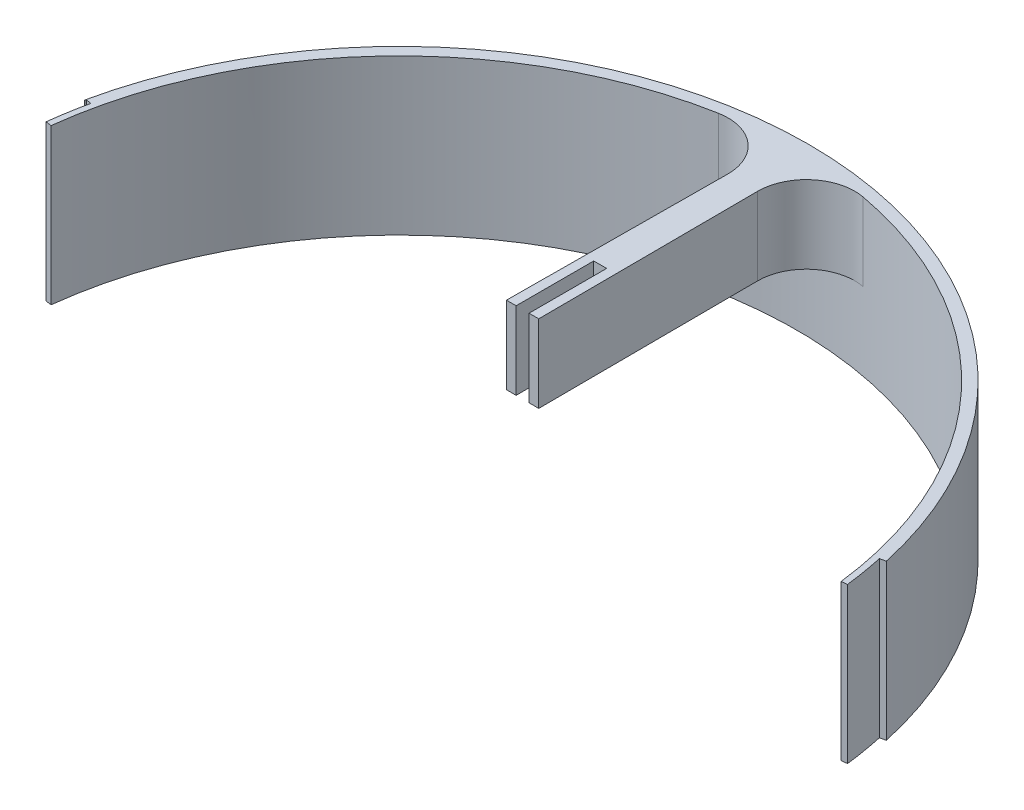
ISO-10303-21;
HEADER;
FILE_DESCRIPTION(('STEP AP214'),'2;1');
FILE_NAME('part.step','',(''),(''),'','','');
FILE_SCHEMA(('AUTOMOTIVE_DESIGN { 1 0 10303 214 1 1 1 1 }'));
ENDSEC;
DATA;
#1=APPLICATION_CONTEXT('core data for automotive mechanical design processes');
#2=APPLICATION_PROTOCOL_DEFINITION('international standard','automotive_design',2000,#1);
#3=PRODUCT_CONTEXT('',#1,'mechanical');
#4=PRODUCT('Part','Part','',(#3));
#5=PRODUCT_RELATED_PRODUCT_CATEGORY('part','',(#4));
#6=PRODUCT_DEFINITION_FORMATION('','',#4);
#7=PRODUCT_DEFINITION_CONTEXT('part definition',#1,'design');
#8=PRODUCT_DEFINITION('design','',#6,#7);
#9=PRODUCT_DEFINITION_SHAPE('','',#8);
#10=(LENGTH_UNIT() NAMED_UNIT(*) SI_UNIT(.MILLI.,.METRE.));
#11=(NAMED_UNIT(*) PLANE_ANGLE_UNIT() SI_UNIT($,.RADIAN.));
#12=(NAMED_UNIT(*) SI_UNIT($,.STERADIAN.) SOLID_ANGLE_UNIT());
#13=UNCERTAINTY_MEASURE_WITH_UNIT(LENGTH_MEASURE(1.E-05),#10,'distance_accuracy_value','');
#14=(GEOMETRIC_REPRESENTATION_CONTEXT(3) GLOBAL_UNCERTAINTY_ASSIGNED_CONTEXT((#13)) GLOBAL_UNIT_ASSIGNED_CONTEXT((#10,
#11,#12)) REPRESENTATION_CONTEXT('',''));
#15=CARTESIAN_POINT('',(0.,0.,0.));
#16=DIRECTION('',(0.,0.,1.));
#17=DIRECTION('',(1.,0.,0.));
#18=AXIS2_PLACEMENT_3D('',#15,#16,#17);
#19=CARTESIAN_POINT('',(0.,20.,0.));
#20=DIRECTION('',(0.,1.,0.));
#21=DIRECTION('',(0.,0.,1.));
#22=AXIS2_PLACEMENT_3D('',#19,#20,#21);
#23=PLANE('',#22);
#24=DIRECTION('',(-0.993007417272773,0.,0.118051976862974));
#25=VECTOR('',#24,1.);
#26=CARTESIAN_POINT('',(101.644150293604,20.,-12.0837897784012));
#27=LINE('',#26,#25);
#28=CARTESIAN_POINT('',(103.272771396368,20.,-12.2774055937495));
#29=VERTEX_POINT('',#28);
#30=CARTESIAN_POINT('',(101.783260270459,20.,-12.100327628455));
#31=VERTEX_POINT('',#30);
#32=EDGE_CURVE('E176',#29,#31,#27,.T.);
#33=ORIENTED_EDGE('',*,*,#32,.F.);
#34=CARTESIAN_POINT('',(0.,20.,0.));
#35=DIRECTION('',(0.,-1.,0.));
#36=DIRECTION('',(0.,0.,1.));
#37=AXIS2_PLACEMENT_3D('',#34,#35,#36);
#38=CIRCLE('',#37,104.);
#39=CARTESIAN_POINT('',(101.616209325979,20.,-22.1392412295197));
#40=VERTEX_POINT('',#39);
#41=EDGE_CURVE('E319',#40,#29,#38,.T.);
#42=ORIENTED_EDGE('',*,*,#41,.F.);
#43=DIRECTION('',(-0.977078935826719,0.,0.212877319514613));
#44=VECTOR('',#43,1.);
#45=CARTESIAN_POINT('',(101.616209325979,20.,-22.1392412295197));
#46=LINE('',#45,#44);
#47=CARTESIAN_POINT('',(103.081827729719,20.,-22.4585572087916));
#48=VERTEX_POINT('',#47);
#49=EDGE_CURVE('E316',#48,#40,#46,.T.);
#50=ORIENTED_EDGE('',*,*,#49,.F.);
#51=CARTESIAN_POINT('',(0.,20.,0.));
#52=DIRECTION('',(0.,1.,0.));
#53=DIRECTION('',(0.,0.,1.));
#54=AXIS2_PLACEMENT_3D('',#51,#52,#53);
#55=CIRCLE('',#54,105.5);
#56=CARTESIAN_POINT('',(-103.161703727331,20.,-22.0887501700399));
#57=VERTEX_POINT('',#56);
#58=EDGE_CURVE('E239',#48,#57,#55,.T.);
#59=ORIENTED_EDGE('',*,*,#58,.T.);
#60=DIRECTION('',(-0.524152135675419,0.,0.851624646582576));
#61=VECTOR('',#60,1.);
#62=CARTESIAN_POINT('',(-102.977987087797,20.,-22.3872467468266));
#63=LINE('',#62,#61);
#64=CARTESIAN_POINT('',(-102.977987087797,20.,-22.3872467468266));
#65=VERTEX_POINT('',#64);
#66=EDGE_CURVE('E314',#65,#57,#63,.T.);
#67=ORIENTED_EDGE('',*,*,#66,.F.);
#68=DIRECTION('',(-0.977174930271424,0.,-0.212436239020174));
#69=VECTOR('',#68,1.);
#70=CARTESIAN_POINT('',(-101.626192748228,20.,-22.093368858098));
#71=LINE('',#70,#69);
#72=CARTESIAN_POINT('',(-101.626192748228,20.,-22.093368858098));
#73=VERTEX_POINT('',#72);
#74=EDGE_CURVE('E311',#73,#65,#71,.T.);
#75=ORIENTED_EDGE('',*,*,#74,.F.);
#76=CARTESIAN_POINT('',(0.,20.,0.));
#77=DIRECTION('',(0.,-1.,0.));
#78=DIRECTION('',(0.,0.,1.));
#79=AXIS2_PLACEMENT_3D('',#76,#77,#78);
#80=CIRCLE('',#79,104.);
#81=CARTESIAN_POINT('',(-103.278302962993,20.,-12.2307864458558));
#82=VERTEX_POINT('',#81);
#83=EDGE_CURVE('E308',#82,#73,#80,.T.);
#84=ORIENTED_EDGE('',*,*,#83,.F.);
#85=DIRECTION('',(-0.993060605413399,0.,-0.117603715825537));
#86=VECTOR('',#85,1.);
#87=CARTESIAN_POINT('',(-101.788712054873,20.,-12.0543808721175));
#88=LINE('',#87,#86);
#89=CARTESIAN_POINT('',(-101.788712054873,20.,-12.0543808721175));
#90=VERTEX_POINT('',#89);
#91=EDGE_CURVE('E306',#90,#82,#88,.T.);
#92=ORIENTED_EDGE('',*,*,#91,.F.);
#93=CARTESIAN_POINT('',(0.,20.,0.));
#94=DIRECTION('',(0.,1.,0.));
#95=DIRECTION('',(-0.866025403784443,0.,-0.499999999999992));
#96=AXIS2_PLACEMENT_3D('',#93,#94,#95);
#97=CIRCLE('',#96,102.5);
#98=CARTESIAN_POINT('',(-18.5204710099084,20.,-100.812906681492));
#99=VERTEX_POINT('',#98);
#100=EDGE_CURVE('E186',#99,#90,#97,.T.);
#101=ORIENTED_EDGE('',*,*,#100,.F.);
#102=CARTESIAN_POINT('',(-16.2618769843098,20.,-88.5186497691146));
#103=DIRECTION('',(0.,1.,0.));
#104=DIRECTION('',(-0.866025403784443,0.,-0.499999999999992));
#105=AXIS2_PLACEMENT_3D('',#102,#103,#104);
#106=CIRCLE('',#105,12.5);
#107=CARTESIAN_POINT('',(-3.76214999314405,20.,-88.4360353253297));
#108=VERTEX_POINT('',#107);
#109=EDGE_CURVE('E197',#108,#99,#106,.T.);
#110=ORIENTED_EDGE('',*,*,#109,.F.);
#111=DIRECTION('',(0.00660915550279195,0.,-0.999978159293262));
#112=VECTOR('',#111,1.);
#113=CARTESIAN_POINT('',(-4.13670479388319,20.,-31.7651611055646));
#114=LINE('',#113,#112);
#115=CARTESIAN_POINT('',(-4.13670479388319,20.,-31.7651611055646));
#116=VERTEX_POINT('',#115);
#117=EDGE_CURVE('E208',#116,#108,#114,.T.);
#118=ORIENTED_EDGE('',*,*,#117,.F.);
#119=DIRECTION('',(-0.999999854762667,0.,-0.000538956998216711));
#120=VECTOR('',#119,1.);
#121=CARTESIAN_POINT('',(-4.13670479388319,20.,-31.7651611055646));
#122=LINE('',#121,#120);
#123=CARTESIAN_POINT('',(-1.63670515697653,20.,-31.763813713069));
#124=VERTEX_POINT('',#123);
#125=EDGE_CURVE('E304',#124,#116,#122,.T.);
#126=ORIENTED_EDGE('',*,*,#125,.F.);
#127=DIRECTION('',(0.,0.,1.));
#128=VECTOR('',#127,1.);
#129=CARTESIAN_POINT('',(-1.63670515697653,20.,-51.7620184206606));
#130=LINE('',#129,#128);
#131=CARTESIAN_POINT('',(-1.63670515697653,20.,-51.7620184206606));
#132=VERTEX_POINT('',#131);
#133=EDGE_CURVE('E301',#132,#124,#130,.T.);
#134=ORIENTED_EDGE('',*,*,#133,.F.);
#135=DIRECTION('',(-1.,0.,0.));
#136=VECTOR('',#135,1.);
#137=CARTESIAN_POINT('',(1.69434380161148,20.,-51.7620184206606));
#138=LINE('',#137,#136);
#139=CARTESIAN_POINT('',(1.69434380161148,20.,-51.7620184206606));
#140=VERTEX_POINT('',#139);
#141=EDGE_CURVE('E295',#140,#132,#138,.T.);
#142=ORIENTED_EDGE('',*,*,#141,.F.);
#143=DIRECTION('',(0.,0.,-1.));
#144=VECTOR('',#143,1.);
#145=CARTESIAN_POINT('',(1.69434380161148,20.,-31.7620184206606));
#146=LINE('',#145,#144);
#147=CARTESIAN_POINT('',(1.69434380161148,20.,-31.7620184206606));
#148=VERTEX_POINT('',#147);
#149=EDGE_CURVE('E265',#148,#140,#146,.T.);
#150=ORIENTED_EDGE('',*,*,#149,.F.);
#151=DIRECTION('',(-0.999999854762667,0.,-0.000538956998216711));
#152=VECTOR('',#151,1.);
#153=CARTESIAN_POINT('',(4.19434343851814,20.,-31.7606710281651));
#154=LINE('',#153,#152);
#155=CARTESIAN_POINT('',(4.19434343851814,20.,-31.7606710281651));
#156=VERTEX_POINT('',#155);
#157=EDGE_CURVE('E293',#156,#148,#154,.T.);
#158=ORIENTED_EDGE('',*,*,#157,.F.);
#159=DIRECTION('',(0.00464043077860199,0.,0.999989233143132));
#160=VECTOR('',#159,1.);
#161=CARTESIAN_POINT('',(4.19434343851814,20.,-31.7606710281651));
#162=LINE('',#161,#160);
#163=CARTESIAN_POINT('',(3.93137346408635,20.,-88.4293631427684));
#164=VERTEX_POINT('',#163);
#165=EDGE_CURVE('E227',#164,#156,#162,.T.);
#166=ORIENTED_EDGE('',*,*,#165,.F.);
#167=CARTESIAN_POINT('',(16.4312388783755,20.,-88.4873685275009));
#168=DIRECTION('',(0.,1.,0.));
#169=DIRECTION('',(0.866025403784436,0.,-0.500000000000004));
#170=AXIS2_PLACEMENT_3D('',#167,#168,#169);
#171=CIRCLE('',#170,12.5);
#172=CARTESIAN_POINT('',(18.713355389261,20.,-100.777280822987));
#173=VERTEX_POINT('',#172);
#174=EDGE_CURVE('E232',#173,#164,#171,.T.);
#175=ORIENTED_EDGE('',*,*,#174,.F.);
#176=CARTESIAN_POINT('',(0.,20.,0.));
#177=DIRECTION('',(0.,1.,0.));
#178=DIRECTION('',(0.866025403784436,0.,-0.500000000000004));
#179=AXIS2_PLACEMENT_3D('',#176,#177,#178);
#180=CIRCLE('',#179,102.5);
#181=EDGE_CURVE('E218',#31,#173,#180,.T.);
#182=ORIENTED_EDGE('',*,*,#181,.F.);
#183=EDGE_LOOP('',(#33,#42,#50,#59,#67,#75,#84,#92,#101,#110,#118,#126,#134,#142,#150,#158,#166,
#175,#182));
#184=FACE_BOUND('',#183,.T.);
#185=ADVANCED_FACE('F37',(#184),#23,.T.);
#186=CARTESIAN_POINT('',(0.,0.,0.));
#187=DIRECTION('',(0.,1.,0.));
#188=DIRECTION('',(0.,0.,1.));
#189=AXIS2_PLACEMENT_3D('',#186,#187,#188);
#190=PLANE('',#189);
#191=DIRECTION('',(0.,0.,1.));
#192=VECTOR('',#191,1.);
#193=CARTESIAN_POINT('',(-1.63670515697652,0.,0.));
#194=LINE('',#193,#192);
#195=CARTESIAN_POINT('',(-1.63670515697653,0.,-51.7620184206606));
#196=VERTEX_POINT('',#195);
#197=CARTESIAN_POINT('',(-1.63670515697653,0.,-31.763813713069));
#198=VERTEX_POINT('',#197);
#199=EDGE_CURVE('E12',#196,#198,#194,.T.);
#200=ORIENTED_EDGE('',*,*,#199,.T.);
#201=DIRECTION('',(-0.999999854762667,0.,-0.000538956998216711));
#202=VECTOR('',#201,1.);
#203=CARTESIAN_POINT('',(0.0171188517829937,0.,-31.7629223729162));
#204=LINE('',#203,#202);
#205=CARTESIAN_POINT('',(-4.13670479388319,0.,-31.7651611055646));
#206=VERTEX_POINT('',#205);
#207=EDGE_CURVE('E278',#198,#206,#204,.T.);
#208=ORIENTED_EDGE('',*,*,#207,.T.);
#209=DIRECTION('',(0.00660915550279195,0.,-0.999978159293262));
#210=VECTOR('',#209,1.);
#211=CARTESIAN_POINT('',(-4.13670479388319,0.,-31.7651611055646));
#212=LINE('',#211,#210);
#213=CARTESIAN_POINT('',(-3.76214999314405,0.,-88.4360353253297));
#214=VERTEX_POINT('',#213);
#215=EDGE_CURVE('E207',#206,#214,#212,.T.);
#216=ORIENTED_EDGE('',*,*,#215,.T.);
#217=CARTESIAN_POINT('',(-16.2618769843098,0.,-88.5186497691146));
#218=DIRECTION('',(0.,1.,0.));
#219=DIRECTION('',(-0.866025403784443,0.,-0.499999999999992));
#220=AXIS2_PLACEMENT_3D('',#217,#218,#219);
#221=CIRCLE('',#220,12.5);
#222=CARTESIAN_POINT('',(-18.5204710099084,0.,-100.812906681492));
#223=VERTEX_POINT('',#222);
#224=EDGE_CURVE('E204',#214,#223,#221,.T.);
#225=ORIENTED_EDGE('',*,*,#224,.T.);
#226=CARTESIAN_POINT('',(0.,0.,0.));
#227=DIRECTION('',(0.,-1.,0.));
#228=DIRECTION('',(0.,0.,-1.));
#229=AXIS2_PLACEMENT_3D('',#226,#227,#228);
#230=CIRCLE('',#229,102.5);
#231=CARTESIAN_POINT('',(18.713355389261,0.,-100.777280822987));
#232=VERTEX_POINT('',#231);
#233=EDGE_CURVE('E194',#223,#232,#230,.T.);
#234=ORIENTED_EDGE('',*,*,#233,.T.);
#235=CARTESIAN_POINT('',(16.4312388783755,0.,-88.4873685275009));
#236=DIRECTION('',(0.,1.,0.));
#237=DIRECTION('',(0.866025403784436,0.,-0.500000000000004));
#238=AXIS2_PLACEMENT_3D('',#235,#236,#237);
#239=CIRCLE('',#238,12.5);
#240=CARTESIAN_POINT('',(3.93137346408635,0.,-88.4293631427684));
#241=VERTEX_POINT('',#240);
#242=EDGE_CURVE('E223',#232,#241,#239,.T.);
#243=ORIENTED_EDGE('',*,*,#242,.T.);
#244=DIRECTION('',(0.00464043077860199,0.,0.999989233143132));
#245=VECTOR('',#244,1.);
#246=CARTESIAN_POINT('',(4.19434343851814,0.,-31.7606710281651));
#247=LINE('',#246,#245);
#248=CARTESIAN_POINT('',(4.19434343851814,0.,-31.7606710281651));
#249=VERTEX_POINT('',#248);
#250=EDGE_CURVE('E226',#241,#249,#247,.T.);
#251=ORIENTED_EDGE('',*,*,#250,.T.);
#252=DIRECTION('',(-0.999999854762667,0.,-0.000538956998216711));
#253=VECTOR('',#252,1.);
#254=CARTESIAN_POINT('',(0.0171188517829937,0.,-31.7629223729162));
#255=LINE('',#254,#253);
#256=CARTESIAN_POINT('',(1.69434380161148,0.,-31.7620184206606));
#257=VERTEX_POINT('',#256);
#258=EDGE_CURVE('E199',#249,#257,#255,.T.);
#259=ORIENTED_EDGE('',*,*,#258,.T.);
#260=DIRECTION('',(0.,0.,-1.));
#261=VECTOR('',#260,1.);
#262=CARTESIAN_POINT('',(1.69434380161148,0.,0.));
#263=LINE('',#262,#261);
#264=CARTESIAN_POINT('',(1.69434380161148,0.,-51.7620184206606));
#265=VERTEX_POINT('',#264);
#266=EDGE_CURVE('E246',#257,#265,#263,.T.);
#267=ORIENTED_EDGE('',*,*,#266,.T.);
#268=DIRECTION('',(-1.,0.,0.));
#269=VECTOR('',#268,1.);
#270=CARTESIAN_POINT('',(0.,0.,-51.7620184206606));
#271=LINE('',#270,#269);
#272=EDGE_CURVE('E45',#265,#196,#271,.T.);
#273=ORIENTED_EDGE('',*,*,#272,.T.);
#274=EDGE_LOOP('',(#200,#208,#216,#225,#234,#243,#251,#259,#267,#273));
#275=FACE_BOUND('',#274,.T.);
#276=ADVANCED_FACE('F250',(#275),#190,.F.);
#277=CARTESIAN_POINT('',(0.,20.,0.));
#278=DIRECTION('',(0.,-1.,0.));
#279=DIRECTION('',(0.,0.,-1.));
#280=AXIS2_PLACEMENT_3D('',#277,#278,#279);
#281=CYLINDRICAL_SURFACE('',#280,105.5);
#282=ORIENTED_EDGE('',*,*,#58,.F.);
#283=DIRECTION('',(0.,1.,0.));
#284=VECTOR('',#283,1.);
#285=CARTESIAN_POINT('',(103.081827729719,-20.,-22.4585572087916));
#286=LINE('',#285,#284);
#287=CARTESIAN_POINT('',(103.081827729719,-20.,-22.4585572087916));
#288=VERTEX_POINT('',#287);
#289=EDGE_CURVE('E326',#288,#48,#286,.T.);
#290=ORIENTED_EDGE('',*,*,#289,.F.);
#291=CARTESIAN_POINT('',(0.,-20.,0.));
#292=DIRECTION('',(0.,-1.,0.));
#293=DIRECTION('',(0.,0.,-1.));
#294=AXIS2_PLACEMENT_3D('',#291,#292,#293);
#295=CIRCLE('',#294,105.5);
#296=CARTESIAN_POINT('',(-103.161703727331,-20.,-22.0887501700398));
#297=VERTEX_POINT('',#296);
#298=EDGE_CURVE('E193',#297,#288,#295,.T.);
#299=ORIENTED_EDGE('',*,*,#298,.F.);
#300=DIRECTION('',(0.,-1.,0.));
#301=VECTOR('',#300,1.);
#302=CARTESIAN_POINT('',(-103.161703727331,20.,-22.0887501700399));
#303=LINE('',#302,#301);
#304=EDGE_CURVE('E273',#297,#57,#303,.F.);
#305=ORIENTED_EDGE('',*,*,#304,.T.);
#306=EDGE_LOOP('',(#282,#290,#299,#305));
#307=FACE_BOUND('',#306,.T.);
#308=ADVANCED_FACE('F39',(#307),#281,.T.);
#309=CARTESIAN_POINT('',(4.19434343851814,0.,-31.7606710281651));
#310=DIRECTION('',(-0.999989233143132,0.,0.00464043077860199));
#311=DIRECTION('',(0.00464043077860199,0.,0.999989233143132));
#312=AXIS2_PLACEMENT_3D('',#309,#310,#311);
#313=PLANE('',#312);
#314=ORIENTED_EDGE('',*,*,#165,.T.);
#315=DIRECTION('',(0.,1.,0.));
#316=VECTOR('',#315,1.);
#317=CARTESIAN_POINT('',(4.19434343851814,0.,-31.7606710281651));
#318=LINE('',#317,#316);
#319=EDGE_CURVE('E237',#249,#156,#318,.T.);
#320=ORIENTED_EDGE('',*,*,#319,.F.);
#321=ORIENTED_EDGE('',*,*,#250,.F.);
#322=DIRECTION('',(0.,1.,0.));
#323=VECTOR('',#322,1.);
#324=CARTESIAN_POINT('',(3.93137346408635,0.,-88.4293631427684));
#325=LINE('',#324,#323);
#326=EDGE_CURVE('E240',#241,#164,#325,.T.);
#327=ORIENTED_EDGE('',*,*,#326,.T.);
#328=EDGE_LOOP('',(#314,#320,#321,#327));
#329=FACE_BOUND('',#328,.T.);
#330=ADVANCED_FACE('F287',(#329),#313,.F.);
#331=CARTESIAN_POINT('',(16.4312388783755,0.,-88.4873685275009));
#332=DIRECTION('',(0.,1.,0.));
#333=DIRECTION('',(0.,0.,1.));
#334=AXIS2_PLACEMENT_3D('',#331,#332,#333);
#335=CYLINDRICAL_SURFACE('',#334,12.5);
#336=ORIENTED_EDGE('',*,*,#174,.T.);
#337=ORIENTED_EDGE('',*,*,#326,.F.);
#338=ORIENTED_EDGE('',*,*,#242,.F.);
#339=DIRECTION('',(0.,1.,0.));
#340=VECTOR('',#339,1.);
#341=CARTESIAN_POINT('',(18.713355389261,0.,-100.777280822987));
#342=LINE('',#341,#340);
#343=EDGE_CURVE('E230',#232,#173,#342,.T.);
#344=ORIENTED_EDGE('',*,*,#343,.T.);
#345=EDGE_LOOP('',(#336,#337,#338,#344));
#346=FACE_BOUND('',#345,.T.);
#347=ADVANCED_FACE('F349',(#346),#335,.F.);
#348=CARTESIAN_POINT('',(-16.2618769843098,0.,-88.5186497691146));
#349=DIRECTION('',(0.,1.,0.));
#350=DIRECTION('',(0.,0.,1.));
#351=AXIS2_PLACEMENT_3D('',#348,#349,#350);
#352=CYLINDRICAL_SURFACE('',#351,12.5);
#353=ORIENTED_EDGE('',*,*,#109,.T.);
#354=DIRECTION('',(0.,1.,0.));
#355=VECTOR('',#354,1.);
#356=CARTESIAN_POINT('',(-18.5204710099084,0.,-100.812906681492));
#357=LINE('',#356,#355);
#358=EDGE_CURVE('E211',#223,#99,#357,.T.);
#359=ORIENTED_EDGE('',*,*,#358,.F.);
#360=ORIENTED_EDGE('',*,*,#224,.F.);
#361=DIRECTION('',(0.,1.,0.));
#362=VECTOR('',#361,1.);
#363=CARTESIAN_POINT('',(-3.76214999314405,0.,-88.4360353253297));
#364=LINE('',#363,#362);
#365=EDGE_CURVE('E216',#214,#108,#364,.T.);
#366=ORIENTED_EDGE('',*,*,#365,.T.);
#367=EDGE_LOOP('',(#353,#359,#360,#366));
#368=FACE_BOUND('',#367,.T.);
#369=ADVANCED_FACE('F351',(#368),#352,.F.);
#370=CARTESIAN_POINT('',(-4.13670479388319,0.,-31.7651611055646));
#371=DIRECTION('',(0.999978159293262,0.,0.00660915550279195));
#372=DIRECTION('',(0.00660915550279195,0.,-0.999978159293262));
#373=AXIS2_PLACEMENT_3D('',#370,#371,#372);
#374=PLANE('',#373);
#375=ORIENTED_EDGE('',*,*,#117,.T.);
#376=ORIENTED_EDGE('',*,*,#365,.F.);
#377=ORIENTED_EDGE('',*,*,#215,.F.);
#378=DIRECTION('',(0.,1.,0.));
#379=VECTOR('',#378,1.);
#380=CARTESIAN_POINT('',(-4.13670479388319,0.,-31.7651611055646));
#381=LINE('',#380,#379);
#382=EDGE_CURVE('E219',#206,#116,#381,.T.);
#383=ORIENTED_EDGE('',*,*,#382,.T.);
#384=EDGE_LOOP('',(#375,#376,#377,#383));
#385=FACE_BOUND('',#384,.T.);
#386=ADVANCED_FACE('F342',(#385),#374,.F.);
#387=CARTESIAN_POINT('',(0.,0.,0.));
#388=DIRECTION('',(0.,1.,0.));
#389=DIRECTION('',(0.,0.,1.));
#390=AXIS2_PLACEMENT_3D('',#387,#388,#389);
#391=CYLINDRICAL_SURFACE('',#390,102.5);
#392=CARTESIAN_POINT('',(0.,-20.,0.));
#393=DIRECTION('',(0.,-1.,0.));
#394=DIRECTION('',(0.,0.,-1.));
#395=AXIS2_PLACEMENT_3D('',#392,#393,#394);
#396=CIRCLE('',#395,102.5);
#397=CARTESIAN_POINT('',(-101.788712054873,-20.,-12.0543808721175));
#398=VERTEX_POINT('',#397);
#399=CARTESIAN_POINT('',(101.783260270459,-20.,-12.100327628455));
#400=VERTEX_POINT('',#399);
#401=EDGE_CURVE('E183',#398,#400,#396,.T.);
#402=ORIENTED_EDGE('',*,*,#401,.T.);
#403=DIRECTION('',(0.,1.,0.));
#404=VECTOR('',#403,1.);
#405=CARTESIAN_POINT('',(101.783260270459,0.,-12.100327628455));
#406=LINE('',#405,#404);
#407=EDGE_CURVE('E276',#400,#31,#406,.T.);
#408=ORIENTED_EDGE('',*,*,#407,.T.);
#409=ORIENTED_EDGE('',*,*,#181,.T.);
#410=ORIENTED_EDGE('',*,*,#343,.F.);
#411=ORIENTED_EDGE('',*,*,#233,.F.);
#412=ORIENTED_EDGE('',*,*,#358,.T.);
#413=ORIENTED_EDGE('',*,*,#100,.T.);
#414=DIRECTION('',(0.,1.,0.));
#415=VECTOR('',#414,1.);
#416=CARTESIAN_POINT('',(-101.788712054873,-20.,-12.0543808721175));
#417=LINE('',#416,#415);
#418=EDGE_CURVE('E171',#398,#90,#417,.T.);
#419=ORIENTED_EDGE('',*,*,#418,.F.);
#420=EDGE_LOOP('',(#402,#408,#409,#410,#411,#412,#413,#419));
#421=FACE_BOUND('',#420,.T.);
#422=ADVANCED_FACE('F181',(#421),#391,.F.);
#423=CARTESIAN_POINT('',(0.,-20.,0.));
#424=DIRECTION('',(0.,-1.,0.));
#425=DIRECTION('',(0.,0.,-1.));
#426=AXIS2_PLACEMENT_3D('',#423,#424,#425);
#427=PLANE('',#426);
#428=DIRECTION('',(-0.993007417272773,0.,0.118051976862974));
#429=VECTOR('',#428,1.);
#430=CARTESIAN_POINT('',(101.644150293604,-20.,-12.0837897784012));
#431=LINE('',#430,#429);
#432=CARTESIAN_POINT('',(103.272771396368,-20.,-12.2774055937495));
#433=VERTEX_POINT('',#432);
#434=EDGE_CURVE('E192',#433,#400,#431,.T.);
#435=ORIENTED_EDGE('',*,*,#434,.T.);
#436=ORIENTED_EDGE('',*,*,#401,.F.);
#437=DIRECTION('',(-0.993060605413399,0.,-0.117603715825537));
#438=VECTOR('',#437,1.);
#439=CARTESIAN_POINT('',(-101.788712054873,-20.,-12.0543808721175));
#440=LINE('',#439,#438);
#441=CARTESIAN_POINT('',(-103.278302962993,-20.,-12.2307864458558));
#442=VERTEX_POINT('',#441);
#443=EDGE_CURVE('E167',#398,#442,#440,.T.);
#444=ORIENTED_EDGE('',*,*,#443,.T.);
#445=CARTESIAN_POINT('',(0.,-20.,0.));
#446=DIRECTION('',(0.,-1.,0.));
#447=DIRECTION('',(0.,0.,1.));
#448=AXIS2_PLACEMENT_3D('',#445,#446,#447);
#449=CIRCLE('',#448,104.);
#450=CARTESIAN_POINT('',(-101.626192748228,-20.,-22.093368858098));
#451=VERTEX_POINT('',#450);
#452=EDGE_CURVE('E60',#442,#451,#449,.T.);
#453=ORIENTED_EDGE('',*,*,#452,.T.);
#454=DIRECTION('',(-0.977174930271424,0.,-0.212436239020174));
#455=VECTOR('',#454,1.);
#456=CARTESIAN_POINT('',(-101.626192748228,-20.,-22.093368858098));
#457=LINE('',#456,#455);
#458=CARTESIAN_POINT('',(-102.977987087797,-20.,-22.3872467468266));
#459=VERTEX_POINT('',#458);
#460=EDGE_CURVE('E384',#451,#459,#457,.T.);
#461=ORIENTED_EDGE('',*,*,#460,.T.);
#462=DIRECTION('',(-0.524152135675419,0.,0.851624646582576));
#463=VECTOR('',#462,1.);
#464=CARTESIAN_POINT('',(-102.977987087797,-20.,-22.3872467468266));
#465=LINE('',#464,#463);
#466=EDGE_CURVE('E381',#459,#297,#465,.T.);
#467=ORIENTED_EDGE('',*,*,#466,.T.);
#468=ORIENTED_EDGE('',*,*,#298,.T.);
#469=DIRECTION('',(-0.977078935826719,0.,0.212877319514613));
#470=VECTOR('',#469,1.);
#471=CARTESIAN_POINT('',(101.616209325979,-20.,-22.1392412295197));
#472=LINE('',#471,#470);
#473=CARTESIAN_POINT('',(101.616209325979,-20.,-22.1392412295197));
#474=VERTEX_POINT('',#473);
#475=EDGE_CURVE('E380',#288,#474,#472,.T.);
#476=ORIENTED_EDGE('',*,*,#475,.T.);
#477=CARTESIAN_POINT('',(0.,-20.,0.));
#478=DIRECTION('',(0.,-1.,0.));
#479=DIRECTION('',(0.,0.,1.));
#480=AXIS2_PLACEMENT_3D('',#477,#478,#479);
#481=CIRCLE('',#480,104.);
#482=EDGE_CURVE('E52',#474,#433,#481,.T.);
#483=ORIENTED_EDGE('',*,*,#482,.T.);
#484=EDGE_LOOP('',(#435,#436,#444,#453,#461,#467,#468,#476,#483));
#485=FACE_BOUND('',#484,.T.);
#486=ADVANCED_FACE('F190',(#485),#427,.T.);
#487=CARTESIAN_POINT('',(-101.788712054873,-20.,-12.0543808721175));
#488=DIRECTION('',(0.117603715825537,0.,-0.993060605413399));
#489=DIRECTION('',(-0.993060605413399,0.,-0.117603715825537));
#490=AXIS2_PLACEMENT_3D('',#487,#488,#489);
#491=PLANE('',#490);
#492=ORIENTED_EDGE('',*,*,#91,.T.);
#493=DIRECTION('',(0.,1.,0.));
#494=VECTOR('',#493,1.);
#495=CARTESIAN_POINT('',(-103.278302962993,-20.,-12.2307864458558));
#496=LINE('',#495,#494);
#497=EDGE_CURVE('E173',#442,#82,#496,.T.);
#498=ORIENTED_EDGE('',*,*,#497,.F.);
#499=ORIENTED_EDGE('',*,*,#443,.F.);
#500=ORIENTED_EDGE('',*,*,#418,.T.);
#501=EDGE_LOOP('',(#492,#498,#499,#500));
#502=FACE_BOUND('',#501,.T.);
#503=ADVANCED_FACE('F170',(#502),#491,.F.);
#504=CARTESIAN_POINT('',(0.,-20.,0.));
#505=DIRECTION('',(0.,1.,0.));
#506=DIRECTION('',(0.,0.,1.));
#507=AXIS2_PLACEMENT_3D('',#504,#505,#506);
#508=CYLINDRICAL_SURFACE('',#507,104.);
#509=ORIENTED_EDGE('',*,*,#83,.T.);
#510=DIRECTION('',(0.,1.,0.));
#511=VECTOR('',#510,1.);
#512=CARTESIAN_POINT('',(-101.626192748228,-20.,-22.093368858098));
#513=LINE('',#512,#511);
#514=EDGE_CURVE('E330',#451,#73,#513,.T.);
#515=ORIENTED_EDGE('',*,*,#514,.F.);
#516=ORIENTED_EDGE('',*,*,#452,.F.);
#517=ORIENTED_EDGE('',*,*,#497,.T.);
#518=EDGE_LOOP('',(#509,#515,#516,#517));
#519=FACE_BOUND('',#518,.T.);
#520=ADVANCED_FACE('F403',(#519),#508,.T.);
#521=CARTESIAN_POINT('',(-101.626192748228,-20.,-22.093368858098));
#522=DIRECTION('',(0.212436239020174,0.,-0.977174930271425));
#523=DIRECTION('',(-0.977174930271425,0.,-0.212436239020174));
#524=AXIS2_PLACEMENT_3D('',#521,#522,#523);
#525=PLANE('',#524);
#526=ORIENTED_EDGE('',*,*,#74,.T.);
#527=DIRECTION('',(0.,1.,0.));
#528=VECTOR('',#527,1.);
#529=CARTESIAN_POINT('',(-102.977987087797,-20.,-22.3872467468266));
#530=LINE('',#529,#528);
#531=EDGE_CURVE('E328',#459,#65,#530,.T.);
#532=ORIENTED_EDGE('',*,*,#531,.F.);
#533=ORIENTED_EDGE('',*,*,#460,.F.);
#534=ORIENTED_EDGE('',*,*,#514,.T.);
#535=EDGE_LOOP('',(#526,#532,#533,#534));
#536=FACE_BOUND('',#535,.T.);
#537=ADVANCED_FACE('F392',(#536),#525,.F.);
#538=CARTESIAN_POINT('',(-102.977987087797,-20.,-22.3872467468266));
#539=DIRECTION('',(-0.851624646582576,0.,-0.524152135675419));
#540=DIRECTION('',(-0.524152135675419,0.,0.851624646582576));
#541=AXIS2_PLACEMENT_3D('',#538,#539,#540);
#542=PLANE('',#541);
#543=ORIENTED_EDGE('',*,*,#466,.F.);
#544=ORIENTED_EDGE('',*,*,#531,.T.);
#545=ORIENTED_EDGE('',*,*,#66,.T.);
#546=ORIENTED_EDGE('',*,*,#304,.F.);
#547=EDGE_LOOP('',(#543,#544,#545,#546));
#548=FACE_BOUND('',#547,.T.);
#549=ADVANCED_FACE('F394',(#548),#542,.F.);
#550=CARTESIAN_POINT('',(101.616209325979,-20.,-22.1392412295197));
#551=DIRECTION('',(-0.212877319514613,0.,-0.977078935826719));
#552=DIRECTION('',(-0.977078935826719,0.,0.212877319514613));
#553=AXIS2_PLACEMENT_3D('',#550,#551,#552);
#554=PLANE('',#553);
#555=ORIENTED_EDGE('',*,*,#49,.T.);
#556=DIRECTION('',(0.,1.,0.));
#557=VECTOR('',#556,1.);
#558=CARTESIAN_POINT('',(101.616209325979,-20.,-22.1392412295197));
#559=LINE('',#558,#557);
#560=EDGE_CURVE('E324',#474,#40,#559,.T.);
#561=ORIENTED_EDGE('',*,*,#560,.F.);
#562=ORIENTED_EDGE('',*,*,#475,.F.);
#563=ORIENTED_EDGE('',*,*,#289,.T.);
#564=EDGE_LOOP('',(#555,#561,#562,#563));
#565=FACE_BOUND('',#564,.T.);
#566=ADVANCED_FACE('F378',(#565),#554,.F.);
#567=CARTESIAN_POINT('',(0.,-20.,0.));
#568=DIRECTION('',(0.,1.,0.));
#569=DIRECTION('',(0.,0.,1.));
#570=AXIS2_PLACEMENT_3D('',#567,#568,#569);
#571=CYLINDRICAL_SURFACE('',#570,104.);
#572=ORIENTED_EDGE('',*,*,#41,.T.);
#573=DIRECTION('',(0.,1.,0.));
#574=VECTOR('',#573,1.);
#575=CARTESIAN_POINT('',(103.272771396368,-20.,-12.2774055937495));
#576=LINE('',#575,#574);
#577=EDGE_CURVE('E277',#433,#29,#576,.T.);
#578=ORIENTED_EDGE('',*,*,#577,.F.);
#579=ORIENTED_EDGE('',*,*,#482,.F.);
#580=ORIENTED_EDGE('',*,*,#560,.T.);
#581=EDGE_LOOP('',(#572,#578,#579,#580));
#582=FACE_BOUND('',#581,.T.);
#583=ADVANCED_FACE('F401',(#582),#571,.T.);
#584=CARTESIAN_POINT('',(101.644150293604,-20.,-12.0837897784012));
#585=DIRECTION('',(-0.118051976862974,0.,-0.993007417272773));
#586=DIRECTION('',(-0.993007417272773,0.,0.118051976862974));
#587=AXIS2_PLACEMENT_3D('',#584,#585,#586);
#588=PLANE('',#587);
#589=ORIENTED_EDGE('',*,*,#434,.F.);
#590=ORIENTED_EDGE('',*,*,#577,.T.);
#591=ORIENTED_EDGE('',*,*,#32,.T.);
#592=ORIENTED_EDGE('',*,*,#407,.F.);
#593=EDGE_LOOP('',(#589,#590,#591,#592));
#594=FACE_BOUND('',#593,.T.);
#595=ADVANCED_FACE('F415',(#594),#588,.F.);
#596=CARTESIAN_POINT('',(-1.63670515697653,-20.,-51.7620184206606));
#597=DIRECTION('',(-1.,0.,0.));
#598=DIRECTION('',(0.,0.,1.));
#599=AXIS2_PLACEMENT_3D('',#596,#597,#598);
#600=PLANE('',#599);
#601=DIRECTION('',(0.,1.,0.));
#602=VECTOR('',#601,1.);
#603=CARTESIAN_POINT('',(-1.63670515697653,-20.,-51.7620184206606));
#604=LINE('',#603,#602);
#605=EDGE_CURVE('E260',#196,#132,#604,.T.);
#606=ORIENTED_EDGE('',*,*,#605,.T.);
#607=ORIENTED_EDGE('',*,*,#133,.T.);
#608=DIRECTION('',(0.,1.,0.));
#609=VECTOR('',#608,1.);
#610=CARTESIAN_POINT('',(-1.63670515697653,-20.,-31.763813713069));
#611=LINE('',#610,#609);
#612=EDGE_CURVE('E187',#198,#124,#611,.T.);
#613=ORIENTED_EDGE('',*,*,#612,.F.);
#614=ORIENTED_EDGE('',*,*,#199,.F.);
#615=EDGE_LOOP('',(#606,#607,#613,#614));
#616=FACE_BOUND('',#615,.T.);
#617=ADVANCED_FACE('F338',(#616),#600,.F.);
#618=CARTESIAN_POINT('',(1.69434380161148,-20.,-51.7620184206606));
#619=DIRECTION('',(0.,0.,-1.));
#620=DIRECTION('',(-1.,0.,0.));
#621=AXIS2_PLACEMENT_3D('',#618,#619,#620);
#622=PLANE('',#621);
#623=DIRECTION('',(0.,1.,0.));
#624=VECTOR('',#623,1.);
#625=CARTESIAN_POINT('',(1.69434380161148,-20.,-51.7620184206606));
#626=LINE('',#625,#624);
#627=EDGE_CURVE('E258',#265,#140,#626,.T.);
#628=ORIENTED_EDGE('',*,*,#627,.T.);
#629=ORIENTED_EDGE('',*,*,#141,.T.);
#630=ORIENTED_EDGE('',*,*,#605,.F.);
#631=ORIENTED_EDGE('',*,*,#272,.F.);
#632=EDGE_LOOP('',(#628,#629,#630,#631));
#633=FACE_BOUND('',#632,.T.);
#634=ADVANCED_FACE('F256',(#633),#622,.F.);
#635=CARTESIAN_POINT('',(1.69434380161148,-20.,-31.7620184206606));
#636=DIRECTION('',(1.,0.,0.));
#637=DIRECTION('',(0.,0.,-1.));
#638=AXIS2_PLACEMENT_3D('',#635,#636,#637);
#639=PLANE('',#638);
#640=DIRECTION('',(0.,1.,0.));
#641=VECTOR('',#640,1.);
#642=CARTESIAN_POINT('',(1.69434380161148,-20.,-31.7620184206606));
#643=LINE('',#642,#641);
#644=EDGE_CURVE('E267',#257,#148,#643,.T.);
#645=ORIENTED_EDGE('',*,*,#644,.T.);
#646=ORIENTED_EDGE('',*,*,#149,.T.);
#647=ORIENTED_EDGE('',*,*,#627,.F.);
#648=ORIENTED_EDGE('',*,*,#266,.F.);
#649=EDGE_LOOP('',(#645,#646,#647,#648));
#650=FACE_BOUND('',#649,.T.);
#651=ADVANCED_FACE('F262',(#650),#639,.F.);
#652=CARTESIAN_POINT('',(4.19434343851814,-20.,-31.7606710281651));
#653=DIRECTION('',(0.000538956998216711,0.,-0.999999854762667));
#654=DIRECTION('',(-0.999999854762667,0.,-0.000538956998216711));
#655=AXIS2_PLACEMENT_3D('',#652,#653,#654);
#656=PLANE('',#655);
#657=ORIENTED_EDGE('',*,*,#319,.T.);
#658=ORIENTED_EDGE('',*,*,#157,.T.);
#659=ORIENTED_EDGE('',*,*,#644,.F.);
#660=ORIENTED_EDGE('',*,*,#258,.F.);
#661=EDGE_LOOP('',(#657,#658,#659,#660));
#662=FACE_BOUND('',#661,.T.);
#663=ADVANCED_FACE('F283',(#662),#656,.F.);
#664=CARTESIAN_POINT('',(-4.13670479388319,-20.,-31.7651611055646));
#665=DIRECTION('',(0.000538956998216711,0.,-0.999999854762667));
#666=DIRECTION('',(-0.999999854762667,0.,-0.000538956998216711));
#667=AXIS2_PLACEMENT_3D('',#664,#665,#666);
#668=PLANE('',#667);
#669=ORIENTED_EDGE('',*,*,#612,.T.);
#670=ORIENTED_EDGE('',*,*,#125,.T.);
#671=ORIENTED_EDGE('',*,*,#382,.F.);
#672=ORIENTED_EDGE('',*,*,#207,.F.);
#673=EDGE_LOOP('',(#669,#670,#671,#672));
#674=FACE_BOUND('',#673,.T.);
#675=ADVANCED_FACE('F334',(#674),#668,.F.);
#676=CLOSED_SHELL('',(#185,#276,#308,#330,#347,#369,#386,#422,#486,#503,#520,#537,#549,#566,
#583,#595,#617,#634,#651,#663,#675));
#677=MANIFOLD_SOLID_BREP('B2',#676);
#678=ADVANCED_BREP_SHAPE_REPRESENTATION('',(#18,#677),#14);
#679=SHAPE_DEFINITION_REPRESENTATION(#9,#678);
ENDSEC;
END-ISO-10303-21;
